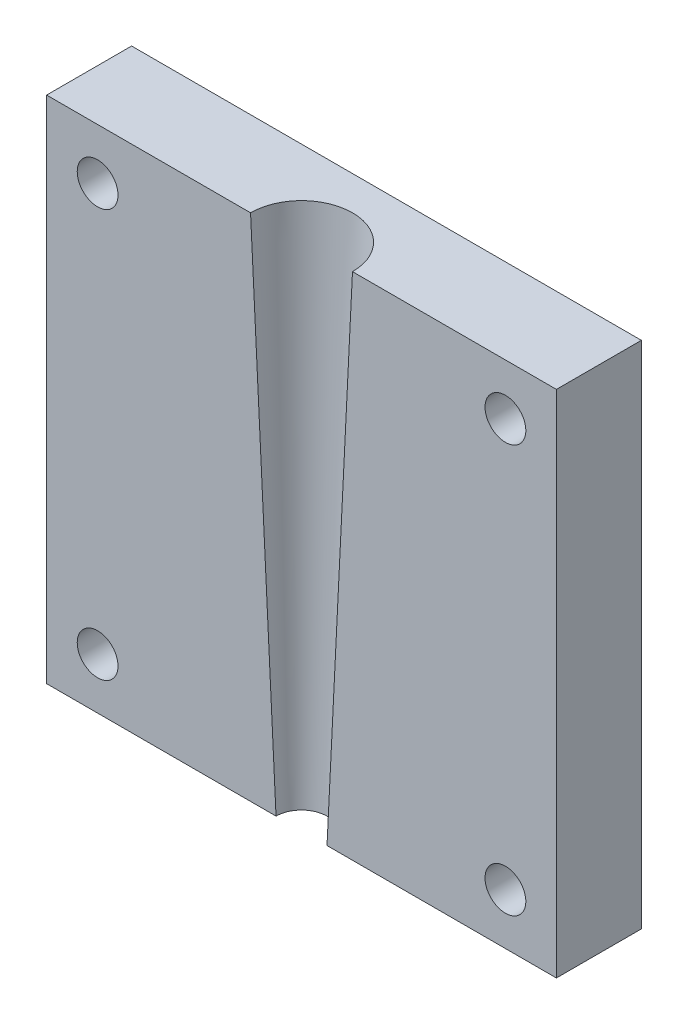
ISO-10303-21;
HEADER;
FILE_DESCRIPTION(('STEP AP214'),'2;1');
FILE_NAME('part.step','',(''),(''),'','','');
FILE_SCHEMA(('AUTOMOTIVE_DESIGN { 1 0 10303 214 1 1 1 1 }'));
ENDSEC;
DATA;
#1=APPLICATION_CONTEXT('core data for automotive mechanical design processes');
#2=APPLICATION_PROTOCOL_DEFINITION('international standard','automotive_design',2000,#1);
#3=PRODUCT_CONTEXT('',#1,'mechanical');
#4=PRODUCT('Part','Part','',(#3));
#5=PRODUCT_RELATED_PRODUCT_CATEGORY('part','',(#4));
#6=PRODUCT_DEFINITION_FORMATION('','',#4);
#7=PRODUCT_DEFINITION_CONTEXT('part definition',#1,'design');
#8=PRODUCT_DEFINITION('design','',#6,#7);
#9=PRODUCT_DEFINITION_SHAPE('','',#8);
#10=(LENGTH_UNIT() NAMED_UNIT(*) SI_UNIT(.MILLI.,.METRE.));
#11=(NAMED_UNIT(*) PLANE_ANGLE_UNIT() SI_UNIT($,.RADIAN.));
#12=(NAMED_UNIT(*) SI_UNIT($,.STERADIAN.) SOLID_ANGLE_UNIT());
#13=UNCERTAINTY_MEASURE_WITH_UNIT(LENGTH_MEASURE(1.E-05),#10,'distance_accuracy_value','');
#14=(GEOMETRIC_REPRESENTATION_CONTEXT(3) GLOBAL_UNCERTAINTY_ASSIGNED_CONTEXT((#13)) GLOBAL_UNIT_ASSIGNED_CONTEXT((#10,
#11,#12)) REPRESENTATION_CONTEXT('',''));
#15=CARTESIAN_POINT('',(0.,0.,0.));
#16=DIRECTION('',(0.,0.,1.));
#17=DIRECTION('',(1.,0.,0.));
#18=AXIS2_PLACEMENT_3D('',#15,#16,#17);
#19=CARTESIAN_POINT('',(0.,0.,5.));
#20=DIRECTION('',(0.,0.,1.));
#21=DIRECTION('',(1.,0.,0.));
#22=AXIS2_PLACEMENT_3D('',#19,#20,#21);
#23=PLANE('',#22);
#24=CARTESIAN_POINT('',(27.,-3.,5.));
#25=DIRECTION('',(0.,0.,-1.));
#26=DIRECTION('',(-1.,0.,0.));
#27=AXIS2_PLACEMENT_3D('',#24,#25,#26);
#28=CIRCLE('',#27,1.2);
#29=CARTESIAN_POINT('',(25.8,-3.,5.));
#30=VERTEX_POINT('',#29);
#31=EDGE_CURVE('E218',#30,#30,#28,.T.);
#32=ORIENTED_EDGE('',*,*,#31,.T.);
#33=EDGE_LOOP('',(#32));
#34=FACE_BOUND('',#33,.T.);
#35=DIRECTION('',(-1.,0.,0.));
#36=VECTOR('',#35,1.);
#37=CARTESIAN_POINT('',(0.,0.,5.));
#38=LINE('',#37,#36);
#39=CARTESIAN_POINT('',(30.,0.,5.));
#40=VERTEX_POINT('',#39);
#41=CARTESIAN_POINT('',(18.,0.,5.));
#42=VERTEX_POINT('',#41);
#43=EDGE_CURVE('E115',#40,#42,#38,.T.);
#44=ORIENTED_EDGE('',*,*,#43,.T.);
#45=DIRECTION('',(-0.0499376169438922,-0.998752338877845,0.));
#46=VECTOR('',#45,1.);
#47=CARTESIAN_POINT('',(18.,0.,5.));
#48=LINE('',#47,#46);
#49=CARTESIAN_POINT('',(16.5,-30.,5.));
#50=VERTEX_POINT('',#49);
#51=EDGE_CURVE('E104',#42,#50,#48,.T.);
#52=ORIENTED_EDGE('',*,*,#51,.T.);
#53=DIRECTION('',(1.,0.,0.));
#54=VECTOR('',#53,1.);
#55=CARTESIAN_POINT('',(0.,-30.,5.));
#56=LINE('',#55,#54);
#57=CARTESIAN_POINT('',(30.,-30.,5.));
#58=VERTEX_POINT('',#57);
#59=EDGE_CURVE('E161',#50,#58,#56,.T.);
#60=ORIENTED_EDGE('',*,*,#59,.T.);
#61=DIRECTION('',(0.,1.,0.));
#62=VECTOR('',#61,1.);
#63=CARTESIAN_POINT('',(30.,0.,5.));
#64=LINE('',#63,#62);
#65=EDGE_CURVE('E121',#58,#40,#64,.T.);
#66=ORIENTED_EDGE('',*,*,#65,.T.);
#67=EDGE_LOOP('',(#44,#52,#60,#66));
#68=FACE_BOUND('',#67,.T.);
#69=CARTESIAN_POINT('',(27.,-27.,5.));
#70=DIRECTION('',(0.,0.,-1.));
#71=DIRECTION('',(-1.,0.,0.));
#72=AXIS2_PLACEMENT_3D('',#69,#70,#71);
#73=CIRCLE('',#72,1.2);
#74=CARTESIAN_POINT('',(25.8,-27.,5.));
#75=VERTEX_POINT('',#74);
#76=EDGE_CURVE('E117',#75,#75,#73,.T.);
#77=ORIENTED_EDGE('',*,*,#76,.T.);
#78=EDGE_LOOP('',(#77));
#79=FACE_BOUND('',#78,.T.);
#80=ADVANCED_FACE('F42',(#34,#68,#79),#23,.T.);
#81=CARTESIAN_POINT('',(0.,0.,0.));
#82=DIRECTION('',(0.,0.,1.));
#83=DIRECTION('',(1.,0.,0.));
#84=AXIS2_PLACEMENT_3D('',#81,#82,#83);
#85=PLANE('',#84);
#86=CARTESIAN_POINT('',(27.,-3.,0.));
#87=DIRECTION('',(0.,0.,-1.));
#88=DIRECTION('',(-1.,0.,0.));
#89=AXIS2_PLACEMENT_3D('',#86,#87,#88);
#90=CIRCLE('',#89,2.5);
#91=CARTESIAN_POINT('',(24.5,-3.,0.));
#92=VERTEX_POINT('',#91);
#93=EDGE_CURVE('E230',#92,#92,#90,.T.);
#94=ORIENTED_EDGE('',*,*,#93,.F.);
#95=EDGE_LOOP('',(#94));
#96=FACE_BOUND('',#95,.T.);
#97=CARTESIAN_POINT('',(3.,-3.,0.));
#98=DIRECTION('',(0.,0.,-1.));
#99=DIRECTION('',(-1.,0.,0.));
#100=AXIS2_PLACEMENT_3D('',#97,#98,#99);
#101=CIRCLE('',#100,2.5);
#102=CARTESIAN_POINT('',(0.5,-3.,0.));
#103=VERTEX_POINT('',#102);
#104=EDGE_CURVE('E214',#103,#103,#101,.T.);
#105=ORIENTED_EDGE('',*,*,#104,.F.);
#106=EDGE_LOOP('',(#105));
#107=FACE_BOUND('',#106,.T.);
#108=CARTESIAN_POINT('',(3.,-27.,0.));
#109=DIRECTION('',(0.,0.,-1.));
#110=DIRECTION('',(-1.,0.,0.));
#111=AXIS2_PLACEMENT_3D('',#108,#109,#110);
#112=CIRCLE('',#111,2.5);
#113=CARTESIAN_POINT('',(0.5,-27.,0.));
#114=VERTEX_POINT('',#113);
#115=EDGE_CURVE('E198',#114,#114,#112,.T.);
#116=ORIENTED_EDGE('',*,*,#115,.F.);
#117=EDGE_LOOP('',(#116));
#118=FACE_BOUND('',#117,.T.);
#119=DIRECTION('',(0.,-1.,0.));
#120=VECTOR('',#119,1.);
#121=CARTESIAN_POINT('',(0.,0.,0.));
#122=LINE('',#121,#120);
#123=CARTESIAN_POINT('',(0.,0.,0.));
#124=VERTEX_POINT('',#123);
#125=CARTESIAN_POINT('',(0.,-30.,0.));
#126=VERTEX_POINT('',#125);
#127=EDGE_CURVE('E133',#124,#126,#122,.T.);
#128=ORIENTED_EDGE('',*,*,#127,.F.);
#129=DIRECTION('',(-1.,0.,0.));
#130=VECTOR('',#129,1.);
#131=CARTESIAN_POINT('',(0.,0.,0.));
#132=LINE('',#131,#130);
#133=CARTESIAN_POINT('',(30.,0.,0.));
#134=VERTEX_POINT('',#133);
#135=EDGE_CURVE('E88',#134,#124,#132,.T.);
#136=ORIENTED_EDGE('',*,*,#135,.F.);
#137=DIRECTION('',(0.,1.,0.));
#138=VECTOR('',#137,1.);
#139=CARTESIAN_POINT('',(30.,0.,0.));
#140=LINE('',#139,#138);
#141=CARTESIAN_POINT('',(30.,-30.,0.));
#142=VERTEX_POINT('',#141);
#143=EDGE_CURVE('E140',#142,#134,#140,.T.);
#144=ORIENTED_EDGE('',*,*,#143,.F.);
#145=DIRECTION('',(1.,0.,0.));
#146=VECTOR('',#145,1.);
#147=CARTESIAN_POINT('',(0.,-30.,0.));
#148=LINE('',#147,#146);
#149=EDGE_CURVE('E137',#126,#142,#148,.T.);
#150=ORIENTED_EDGE('',*,*,#149,.F.);
#151=EDGE_LOOP('',(#128,#136,#144,#150));
#152=FACE_BOUND('',#151,.T.);
#153=CARTESIAN_POINT('',(27.,-27.,0.));
#154=DIRECTION('',(0.,0.,-1.));
#155=DIRECTION('',(-1.,0.,0.));
#156=AXIS2_PLACEMENT_3D('',#153,#154,#155);
#157=CIRCLE('',#156,2.5);
#158=CARTESIAN_POINT('',(24.5,-27.,0.));
#159=VERTEX_POINT('',#158);
#160=EDGE_CURVE('E182',#159,#159,#157,.T.);
#161=ORIENTED_EDGE('',*,*,#160,.F.);
#162=EDGE_LOOP('',(#161));
#163=FACE_BOUND('',#162,.T.);
#164=ADVANCED_FACE('F155',(#96,#107,#118,#152,#163),#85,.F.);
#165=CARTESIAN_POINT('',(3.,-3.,5.));
#166=DIRECTION('',(0.,0.,-1.));
#167=DIRECTION('',(-1.,0.,0.));
#168=AXIS2_PLACEMENT_3D('',#165,#166,#167);
#169=CIRCLE('',#168,1.2);
#170=CARTESIAN_POINT('',(1.8,-3.,5.));
#171=VERTEX_POINT('',#170);
#172=EDGE_CURVE('E202',#171,#171,#169,.T.);
#173=ORIENTED_EDGE('',*,*,#172,.T.);
#174=EDGE_LOOP('',(#173));
#175=FACE_BOUND('',#174,.T.);
#176=CARTESIAN_POINT('',(3.,-27.,5.));
#177=DIRECTION('',(0.,0.,-1.));
#178=DIRECTION('',(-1.,0.,0.));
#179=AXIS2_PLACEMENT_3D('',#176,#177,#178);
#180=CIRCLE('',#179,1.2);
#181=CARTESIAN_POINT('',(1.8,-27.,5.));
#182=VERTEX_POINT('',#181);
#183=EDGE_CURVE('E186',#182,#182,#180,.T.);
#184=ORIENTED_EDGE('',*,*,#183,.T.);
#185=EDGE_LOOP('',(#184));
#186=FACE_BOUND('',#185,.T.);
#187=CARTESIAN_POINT('',(0.,-30.,5.));
#188=VERTEX_POINT('',#187);
#189=CARTESIAN_POINT('',(13.5,-30.,5.));
#190=VERTEX_POINT('',#189);
#191=EDGE_CURVE('E95',#188,#190,#56,.T.);
#192=ORIENTED_EDGE('',*,*,#191,.T.);
#193=DIRECTION('',(0.0499376169438924,-0.998752338877845,0.));
#194=VECTOR('',#193,1.);
#195=CARTESIAN_POINT('',(12.,0.,5.));
#196=LINE('',#195,#194);
#197=CARTESIAN_POINT('',(12.,0.,5.));
#198=VERTEX_POINT('',#197);
#199=EDGE_CURVE('E111',#198,#190,#196,.T.);
#200=ORIENTED_EDGE('',*,*,#199,.F.);
#201=CARTESIAN_POINT('',(0.,0.,5.));
#202=VERTEX_POINT('',#201);
#203=EDGE_CURVE('E66',#198,#202,#38,.T.);
#204=ORIENTED_EDGE('',*,*,#203,.T.);
#205=DIRECTION('',(0.,-1.,0.));
#206=VECTOR('',#205,1.);
#207=CARTESIAN_POINT('',(0.,0.,5.));
#208=LINE('',#207,#206);
#209=EDGE_CURVE('E144',#202,#188,#208,.T.);
#210=ORIENTED_EDGE('',*,*,#209,.T.);
#211=EDGE_LOOP('',(#192,#200,#204,#210));
#212=FACE_BOUND('',#211,.T.);
#213=ADVANCED_FACE('F168',(#175,#186,#212),#23,.T.);
#214=CARTESIAN_POINT('',(0.,0.,5.));
#215=DIRECTION('',(1.,0.,0.));
#216=DIRECTION('',(0.,0.,-1.));
#217=AXIS2_PLACEMENT_3D('',#214,#215,#216);
#218=PLANE('',#217);
#219=ORIENTED_EDGE('',*,*,#127,.T.);
#220=DIRECTION('',(0.,0.,-1.));
#221=VECTOR('',#220,1.);
#222=CARTESIAN_POINT('',(0.,-30.,5.));
#223=LINE('',#222,#221);
#224=EDGE_CURVE('E12',#188,#126,#223,.T.);
#225=ORIENTED_EDGE('',*,*,#224,.F.);
#226=ORIENTED_EDGE('',*,*,#209,.F.);
#227=DIRECTION('',(0.,0.,-1.));
#228=VECTOR('',#227,1.);
#229=CARTESIAN_POINT('',(0.,0.,5.));
#230=LINE('',#229,#228);
#231=EDGE_CURVE('E124',#202,#124,#230,.T.);
#232=ORIENTED_EDGE('',*,*,#231,.T.);
#233=EDGE_LOOP('',(#219,#225,#226,#232));
#234=FACE_BOUND('',#233,.T.);
#235=ADVANCED_FACE('F44',(#234),#218,.F.);
#236=CARTESIAN_POINT('',(0.,-30.,5.));
#237=DIRECTION('',(0.,1.,0.));
#238=DIRECTION('',(0.,0.,1.));
#239=AXIS2_PLACEMENT_3D('',#236,#237,#238);
#240=PLANE('',#239);
#241=CARTESIAN_POINT('',(15.,-30.,5.));
#242=DIRECTION('',(0.,-1.,0.));
#243=DIRECTION('',(0.,0.,-1.));
#244=AXIS2_PLACEMENT_3D('',#241,#242,#243);
#245=CIRCLE('',#244,1.5);
#246=EDGE_CURVE('E106',#190,#50,#245,.T.);
#247=ORIENTED_EDGE('',*,*,#246,.F.);
#248=ORIENTED_EDGE('',*,*,#191,.F.);
#249=ORIENTED_EDGE('',*,*,#224,.T.);
#250=ORIENTED_EDGE('',*,*,#149,.T.);
#251=DIRECTION('',(0.,0.,-1.));
#252=VECTOR('',#251,1.);
#253=CARTESIAN_POINT('',(30.,-30.,5.));
#254=LINE('',#253,#252);
#255=EDGE_CURVE('E51',#58,#142,#254,.T.);
#256=ORIENTED_EDGE('',*,*,#255,.F.);
#257=ORIENTED_EDGE('',*,*,#59,.F.);
#258=EDGE_LOOP('',(#247,#248,#249,#250,#256,#257));
#259=FACE_BOUND('',#258,.T.);
#260=ADVANCED_FACE('F272',(#259),#240,.F.);
#261=CARTESIAN_POINT('',(30.,0.,5.));
#262=DIRECTION('',(-1.,0.,0.));
#263=DIRECTION('',(0.,-1.,0.));
#264=AXIS2_PLACEMENT_3D('',#261,#262,#263);
#265=PLANE('',#264);
#266=ORIENTED_EDGE('',*,*,#143,.T.);
#267=DIRECTION('',(0.,0.,-1.));
#268=VECTOR('',#267,1.);
#269=CARTESIAN_POINT('',(30.,0.,5.));
#270=LINE('',#269,#268);
#271=EDGE_CURVE('E128',#40,#134,#270,.T.);
#272=ORIENTED_EDGE('',*,*,#271,.F.);
#273=ORIENTED_EDGE('',*,*,#65,.F.);
#274=ORIENTED_EDGE('',*,*,#255,.T.);
#275=EDGE_LOOP('',(#266,#272,#273,#274));
#276=FACE_BOUND('',#275,.T.);
#277=ADVANCED_FACE('F152',(#276),#265,.F.);
#278=CARTESIAN_POINT('',(0.,0.,5.));
#279=DIRECTION('',(0.,-1.,0.));
#280=DIRECTION('',(0.,0.,-1.));
#281=AXIS2_PLACEMENT_3D('',#278,#279,#280);
#282=PLANE('',#281);
#283=CARTESIAN_POINT('',(15.,0.,5.));
#284=DIRECTION('',(0.,1.,0.));
#285=DIRECTION('',(0.,0.,1.));
#286=AXIS2_PLACEMENT_3D('',#283,#284,#285);
#287=CIRCLE('',#286,3.);
#288=EDGE_CURVE('E58',#42,#198,#287,.T.);
#289=ORIENTED_EDGE('',*,*,#288,.F.);
#290=ORIENTED_EDGE('',*,*,#43,.F.);
#291=ORIENTED_EDGE('',*,*,#271,.T.);
#292=ORIENTED_EDGE('',*,*,#135,.T.);
#293=ORIENTED_EDGE('',*,*,#231,.F.);
#294=ORIENTED_EDGE('',*,*,#203,.F.);
#295=EDGE_LOOP('',(#289,#290,#291,#292,#293,#294));
#296=FACE_BOUND('',#295,.T.);
#297=ADVANCED_FACE('F114',(#296),#282,.F.);
#298=CARTESIAN_POINT('',(15.,0.,5.));
#299=DIRECTION('',(0.,1.,0.));
#300=DIRECTION('',(0.,0.,1.));
#301=AXIS2_PLACEMENT_3D('',#298,#299,#300);
#302=CONICAL_SURFACE('',#301,3.,0.0499583957219429);
#303=ORIENTED_EDGE('',*,*,#51,.F.);
#304=ORIENTED_EDGE('',*,*,#288,.T.);
#305=ORIENTED_EDGE('',*,*,#199,.T.);
#306=ORIENTED_EDGE('',*,*,#246,.T.);
#307=EDGE_LOOP('',(#303,#304,#305,#306));
#308=FACE_BOUND('',#307,.T.);
#309=ADVANCED_FACE('F105',(#308),#302,.F.);
#310=CARTESIAN_POINT('',(27.,-27.,0.));
#311=DIRECTION('',(0.,0.,-1.));
#312=DIRECTION('',(-1.,0.,0.));
#313=AXIS2_PLACEMENT_3D('',#310,#311,#312);
#314=CYLINDRICAL_SURFACE('',#313,1.2);
#315=ORIENTED_EDGE('',*,*,#76,.F.);
#316=EDGE_LOOP('',(#315));
#317=FACE_BOUND('',#316,.T.);
#318=CARTESIAN_POINT('',(27.,-27.,1.6));
#319=DIRECTION('',(0.,0.,-1.));
#320=DIRECTION('',(-1.,0.,0.));
#321=AXIS2_PLACEMENT_3D('',#318,#319,#320);
#322=CIRCLE('',#321,1.2);
#323=CARTESIAN_POINT('',(25.8,-27.,1.6));
#324=VERTEX_POINT('',#323);
#325=EDGE_CURVE('E174',#324,#324,#322,.T.);
#326=ORIENTED_EDGE('',*,*,#325,.T.);
#327=EDGE_LOOP('',(#326));
#328=FACE_BOUND('',#327,.T.);
#329=ADVANCED_FACE('F292',(#317,#328),#314,.F.);
#330=CARTESIAN_POINT('',(28.2,-27.,1.6));
#331=DIRECTION('',(0.,0.,1.));
#332=DIRECTION('',(1.,0.,0.));
#333=AXIS2_PLACEMENT_3D('',#330,#331,#332);
#334=PLANE('',#333);
#335=ORIENTED_EDGE('',*,*,#325,.F.);
#336=EDGE_LOOP('',(#335));
#337=FACE_BOUND('',#336,.T.);
#338=CARTESIAN_POINT('',(27.,-27.,1.6));
#339=DIRECTION('',(0.,0.,-1.));
#340=DIRECTION('',(-1.,0.,0.));
#341=AXIS2_PLACEMENT_3D('',#338,#339,#340);
#342=CIRCLE('',#341,2.5);
#343=CARTESIAN_POINT('',(24.5,-27.,1.6));
#344=VERTEX_POINT('',#343);
#345=EDGE_CURVE('E178',#344,#344,#342,.T.);
#346=ORIENTED_EDGE('',*,*,#345,.T.);
#347=EDGE_LOOP('',(#346));
#348=FACE_BOUND('',#347,.T.);
#349=ADVANCED_FACE('F286',(#337,#348),#334,.F.);
#350=CARTESIAN_POINT('',(27.,-27.,0.));
#351=DIRECTION('',(0.,0.,-1.));
#352=DIRECTION('',(-1.,0.,0.));
#353=AXIS2_PLACEMENT_3D('',#350,#351,#352);
#354=CYLINDRICAL_SURFACE('',#353,2.5);
#355=ORIENTED_EDGE('',*,*,#345,.F.);
#356=EDGE_LOOP('',(#355));
#357=FACE_BOUND('',#356,.T.);
#358=ORIENTED_EDGE('',*,*,#160,.T.);
#359=EDGE_LOOP('',(#358));
#360=FACE_BOUND('',#359,.T.);
#361=ADVANCED_FACE('F279',(#357,#360),#354,.F.);
#362=CARTESIAN_POINT('',(3.,-27.,0.));
#363=DIRECTION('',(0.,0.,-1.));
#364=DIRECTION('',(-1.,0.,0.));
#365=AXIS2_PLACEMENT_3D('',#362,#363,#364);
#366=CYLINDRICAL_SURFACE('',#365,1.2);
#367=ORIENTED_EDGE('',*,*,#183,.F.);
#368=EDGE_LOOP('',(#367));
#369=FACE_BOUND('',#368,.T.);
#370=CARTESIAN_POINT('',(3.,-27.,1.6));
#371=DIRECTION('',(0.,0.,-1.));
#372=DIRECTION('',(-1.,0.,0.));
#373=AXIS2_PLACEMENT_3D('',#370,#371,#372);
#374=CIRCLE('',#373,1.2);
#375=CARTESIAN_POINT('',(1.8,-27.,1.6));
#376=VERTEX_POINT('',#375);
#377=EDGE_CURVE('E190',#376,#376,#374,.T.);
#378=ORIENTED_EDGE('',*,*,#377,.T.);
#379=EDGE_LOOP('',(#378));
#380=FACE_BOUND('',#379,.T.);
#381=ADVANCED_FACE('F257',(#369,#380),#366,.F.);
#382=CARTESIAN_POINT('',(4.2,-27.,1.6));
#383=DIRECTION('',(0.,0.,1.));
#384=DIRECTION('',(1.,0.,0.));
#385=AXIS2_PLACEMENT_3D('',#382,#383,#384);
#386=PLANE('',#385);
#387=ORIENTED_EDGE('',*,*,#377,.F.);
#388=EDGE_LOOP('',(#387));
#389=FACE_BOUND('',#388,.T.);
#390=CARTESIAN_POINT('',(3.,-27.,1.6));
#391=DIRECTION('',(0.,0.,-1.));
#392=DIRECTION('',(-1.,0.,0.));
#393=AXIS2_PLACEMENT_3D('',#390,#391,#392);
#394=CIRCLE('',#393,2.5);
#395=CARTESIAN_POINT('',(0.5,-27.,1.6));
#396=VERTEX_POINT('',#395);
#397=EDGE_CURVE('E194',#396,#396,#394,.T.);
#398=ORIENTED_EDGE('',*,*,#397,.T.);
#399=EDGE_LOOP('',(#398));
#400=FACE_BOUND('',#399,.T.);
#401=ADVANCED_FACE('F247',(#389,#400),#386,.F.);
#402=CARTESIAN_POINT('',(3.,-27.,0.));
#403=DIRECTION('',(0.,0.,-1.));
#404=DIRECTION('',(-1.,0.,0.));
#405=AXIS2_PLACEMENT_3D('',#402,#403,#404);
#406=CYLINDRICAL_SURFACE('',#405,2.5);
#407=ORIENTED_EDGE('',*,*,#397,.F.);
#408=EDGE_LOOP('',(#407));
#409=FACE_BOUND('',#408,.T.);
#410=ORIENTED_EDGE('',*,*,#115,.T.);
#411=EDGE_LOOP('',(#410));
#412=FACE_BOUND('',#411,.T.);
#413=ADVANCED_FACE('F244',(#409,#412),#406,.F.);
#414=CARTESIAN_POINT('',(3.,-3.,0.));
#415=DIRECTION('',(0.,0.,-1.));
#416=DIRECTION('',(-1.,0.,0.));
#417=AXIS2_PLACEMENT_3D('',#414,#415,#416);
#418=CYLINDRICAL_SURFACE('',#417,1.2);
#419=ORIENTED_EDGE('',*,*,#172,.F.);
#420=EDGE_LOOP('',(#419));
#421=FACE_BOUND('',#420,.T.);
#422=CARTESIAN_POINT('',(3.,-3.,1.6));
#423=DIRECTION('',(0.,0.,-1.));
#424=DIRECTION('',(-1.,0.,0.));
#425=AXIS2_PLACEMENT_3D('',#422,#423,#424);
#426=CIRCLE('',#425,1.2);
#427=CARTESIAN_POINT('',(1.8,-3.,1.6));
#428=VERTEX_POINT('',#427);
#429=EDGE_CURVE('E206',#428,#428,#426,.T.);
#430=ORIENTED_EDGE('',*,*,#429,.T.);
#431=EDGE_LOOP('',(#430));
#432=FACE_BOUND('',#431,.T.);
#433=ADVANCED_FACE('F246',(#421,#432),#418,.F.);
#434=CARTESIAN_POINT('',(4.2,-3.,1.6));
#435=DIRECTION('',(0.,0.,1.));
#436=DIRECTION('',(1.,0.,0.));
#437=AXIS2_PLACEMENT_3D('',#434,#435,#436);
#438=PLANE('',#437);
#439=ORIENTED_EDGE('',*,*,#429,.F.);
#440=EDGE_LOOP('',(#439));
#441=FACE_BOUND('',#440,.T.);
#442=CARTESIAN_POINT('',(3.,-3.,1.6));
#443=DIRECTION('',(0.,0.,-1.));
#444=DIRECTION('',(-1.,0.,0.));
#445=AXIS2_PLACEMENT_3D('',#442,#443,#444);
#446=CIRCLE('',#445,2.5);
#447=CARTESIAN_POINT('',(0.5,-3.,1.6));
#448=VERTEX_POINT('',#447);
#449=EDGE_CURVE('E210',#448,#448,#446,.T.);
#450=ORIENTED_EDGE('',*,*,#449,.T.);
#451=EDGE_LOOP('',(#450));
#452=FACE_BOUND('',#451,.T.);
#453=ADVANCED_FACE('F254',(#441,#452),#438,.F.);
#454=CARTESIAN_POINT('',(3.,-3.,0.));
#455=DIRECTION('',(0.,0.,-1.));
#456=DIRECTION('',(-1.,0.,0.));
#457=AXIS2_PLACEMENT_3D('',#454,#455,#456);
#458=CYLINDRICAL_SURFACE('',#457,2.5);
#459=ORIENTED_EDGE('',*,*,#449,.F.);
#460=EDGE_LOOP('',(#459));
#461=FACE_BOUND('',#460,.T.);
#462=ORIENTED_EDGE('',*,*,#104,.T.);
#463=EDGE_LOOP('',(#462));
#464=FACE_BOUND('',#463,.T.);
#465=ADVANCED_FACE('F385',(#461,#464),#458,.F.);
#466=CARTESIAN_POINT('',(27.,-3.,0.));
#467=DIRECTION('',(0.,0.,-1.));
#468=DIRECTION('',(-1.,0.,0.));
#469=AXIS2_PLACEMENT_3D('',#466,#467,#468);
#470=CYLINDRICAL_SURFACE('',#469,1.2);
#471=ORIENTED_EDGE('',*,*,#31,.F.);
#472=EDGE_LOOP('',(#471));
#473=FACE_BOUND('',#472,.T.);
#474=CARTESIAN_POINT('',(27.,-3.,1.6));
#475=DIRECTION('',(0.,0.,-1.));
#476=DIRECTION('',(-1.,0.,0.));
#477=AXIS2_PLACEMENT_3D('',#474,#475,#476);
#478=CIRCLE('',#477,1.2);
#479=CARTESIAN_POINT('',(25.8,-3.,1.6));
#480=VERTEX_POINT('',#479);
#481=EDGE_CURVE('E222',#480,#480,#478,.T.);
#482=ORIENTED_EDGE('',*,*,#481,.T.);
#483=EDGE_LOOP('',(#482));
#484=FACE_BOUND('',#483,.T.);
#485=ADVANCED_FACE('F394',(#473,#484),#470,.F.);
#486=CARTESIAN_POINT('',(28.2,-3.,1.6));
#487=DIRECTION('',(0.,0.,1.));
#488=DIRECTION('',(1.,0.,0.));
#489=AXIS2_PLACEMENT_3D('',#486,#487,#488);
#490=PLANE('',#489);
#491=ORIENTED_EDGE('',*,*,#481,.F.);
#492=EDGE_LOOP('',(#491));
#493=FACE_BOUND('',#492,.T.);
#494=CARTESIAN_POINT('',(27.,-3.,1.6));
#495=DIRECTION('',(0.,0.,-1.));
#496=DIRECTION('',(-1.,0.,0.));
#497=AXIS2_PLACEMENT_3D('',#494,#495,#496);
#498=CIRCLE('',#497,2.5);
#499=CARTESIAN_POINT('',(24.5,-3.,1.6));
#500=VERTEX_POINT('',#499);
#501=EDGE_CURVE('E226',#500,#500,#498,.T.);
#502=ORIENTED_EDGE('',*,*,#501,.T.);
#503=EDGE_LOOP('',(#502));
#504=FACE_BOUND('',#503,.T.);
#505=ADVANCED_FACE('F403',(#493,#504),#490,.F.);
#506=CARTESIAN_POINT('',(27.,-3.,0.));
#507=DIRECTION('',(0.,0.,-1.));
#508=DIRECTION('',(-1.,0.,0.));
#509=AXIS2_PLACEMENT_3D('',#506,#507,#508);
#510=CYLINDRICAL_SURFACE('',#509,2.5);
#511=ORIENTED_EDGE('',*,*,#501,.F.);
#512=EDGE_LOOP('',(#511));
#513=FACE_BOUND('',#512,.T.);
#514=ORIENTED_EDGE('',*,*,#93,.T.);
#515=EDGE_LOOP('',(#514));
#516=FACE_BOUND('',#515,.T.);
#517=ADVANCED_FACE('F235',(#513,#516),#510,.F.);
#518=CLOSED_SHELL('',(#80,#164,#213,#235,#260,#277,#297,#309,#329,#349,#361,#381,#401,#413,#433,
#453,#465,#485,#505,#517));
#519=MANIFOLD_SOLID_BREP('B2',#518);
#520=ADVANCED_BREP_SHAPE_REPRESENTATION('',(#18,#519),#14);
#521=SHAPE_DEFINITION_REPRESENTATION(#9,#520);
ENDSEC;
END-ISO-10303-21;
